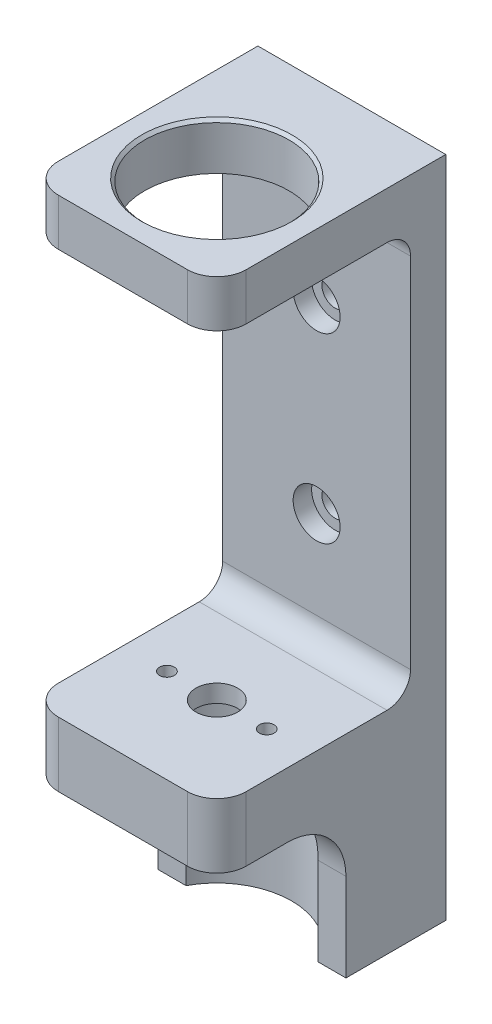
ISO-10303-21;
HEADER;
FILE_DESCRIPTION(('STEP AP214'),'2;1');
FILE_NAME('part.step','',(''),(''),'','','');
FILE_SCHEMA(('AUTOMOTIVE_DESIGN { 1 0 10303 214 1 1 1 1 }'));
ENDSEC;
DATA;
#1=APPLICATION_CONTEXT('core data for automotive mechanical design processes');
#2=APPLICATION_PROTOCOL_DEFINITION('international standard','automotive_design',2000,#1);
#3=PRODUCT_CONTEXT('',#1,'mechanical');
#4=PRODUCT('Part','Part','',(#3));
#5=PRODUCT_RELATED_PRODUCT_CATEGORY('part','',(#4));
#6=PRODUCT_DEFINITION_FORMATION('','',#4);
#7=PRODUCT_DEFINITION_CONTEXT('part definition',#1,'design');
#8=PRODUCT_DEFINITION('design','',#6,#7);
#9=PRODUCT_DEFINITION_SHAPE('','',#8);
#10=(LENGTH_UNIT() NAMED_UNIT(*) SI_UNIT(.MILLI.,.METRE.));
#11=(NAMED_UNIT(*) PLANE_ANGLE_UNIT() SI_UNIT($,.RADIAN.));
#12=(NAMED_UNIT(*) SI_UNIT($,.STERADIAN.) SOLID_ANGLE_UNIT());
#13=UNCERTAINTY_MEASURE_WITH_UNIT(LENGTH_MEASURE(1.E-05),#10,'distance_accuracy_value','');
#14=(GEOMETRIC_REPRESENTATION_CONTEXT(3) GLOBAL_UNCERTAINTY_ASSIGNED_CONTEXT((#13)) GLOBAL_UNIT_ASSIGNED_CONTEXT((#10,
#11,#12)) REPRESENTATION_CONTEXT('',''));
#15=CARTESIAN_POINT('',(0.,0.,0.));
#16=DIRECTION('',(0.,0.,1.));
#17=DIRECTION('',(1.,0.,0.));
#18=AXIS2_PLACEMENT_3D('',#15,#16,#17);
#19=CARTESIAN_POINT('',(14.,70.0000000000001,28.));
#20=DIRECTION('',(0.,1.,0.));
#21=DIRECTION('',(-1.,0.,0.));
#22=AXIS2_PLACEMENT_3D('',#19,#20,#21);
#23=PLANE('',#22);
#24=CARTESIAN_POINT('',(-1.29414805625495E-13,70.0000000000001,14.));
#25=DIRECTION('',(0.,1.,0.));
#26=DIRECTION('',(-1.,0.,0.));
#27=AXIS2_PLACEMENT_3D('',#24,#25,#26);
#28=CIRCLE('',#27,12.3);
#29=CARTESIAN_POINT('',(-12.3000000000001,70.,14.));
#30=VERTEX_POINT('',#29);
#31=EDGE_CURVE('E218',#30,#30,#28,.F.);
#32=ORIENTED_EDGE('',*,*,#31,.F.);
#33=EDGE_LOOP('',(#32));
#34=FACE_BOUND('',#33,.T.);
#35=DIRECTION('',(-1.,0.,0.));
#36=VECTOR('',#35,1.);
#37=CARTESIAN_POINT('',(14.0000000000001,70.,0.999999999999986));
#38=LINE('',#37,#36);
#39=CARTESIAN_POINT('',(16.,70.0000000000001,0.999999999999986));
#40=VERTEX_POINT('',#39);
#41=CARTESIAN_POINT('',(-16.,70.,0.999999999999986));
#42=VERTEX_POINT('',#41);
#43=EDGE_CURVE('E67',#40,#42,#38,.T.);
#44=ORIENTED_EDGE('',*,*,#43,.F.);
#45=DIRECTION('',(0.,0.,1.));
#46=VECTOR('',#45,1.);
#47=CARTESIAN_POINT('',(16.,70.0000000000001,0.));
#48=LINE('',#47,#46);
#49=CARTESIAN_POINT('',(16.,70.0000000000001,25.));
#50=VERTEX_POINT('',#49);
#51=EDGE_CURVE('E282',#40,#50,#48,.T.);
#52=ORIENTED_EDGE('',*,*,#51,.T.);
#53=CARTESIAN_POINT('',(11.,70.0000000000001,25.));
#54=DIRECTION('',(0.,1.,0.));
#55=DIRECTION('',(-1.,0.,0.));
#56=AXIS2_PLACEMENT_3D('',#53,#54,#55);
#57=CIRCLE('',#56,5.);
#58=CARTESIAN_POINT('',(11.,70.0000000000001,30.));
#59=VERTEX_POINT('',#58);
#60=EDGE_CURVE('E291',#50,#59,#57,.F.);
#61=ORIENTED_EDGE('',*,*,#60,.T.);
#62=DIRECTION('',(-1.,0.,0.));
#63=VECTOR('',#62,1.);
#64=CARTESIAN_POINT('',(0.,70.0000000000001,30.));
#65=LINE('',#64,#63);
#66=CARTESIAN_POINT('',(-11.,70.,30.));
#67=VERTEX_POINT('',#66);
#68=EDGE_CURVE('E289',#59,#67,#65,.T.);
#69=ORIENTED_EDGE('',*,*,#68,.T.);
#70=CARTESIAN_POINT('',(-11.,70.,25.));
#71=DIRECTION('',(0.,1.,0.));
#72=DIRECTION('',(-1.,0.,0.));
#73=AXIS2_PLACEMENT_3D('',#70,#71,#72);
#74=CIRCLE('',#73,5.);
#75=CARTESIAN_POINT('',(-16.,70.,25.0000000000001));
#76=VERTEX_POINT('',#75);
#77=EDGE_CURVE('E287',#67,#76,#74,.F.);
#78=ORIENTED_EDGE('',*,*,#77,.T.);
#79=DIRECTION('',(0.,0.,-1.));
#80=VECTOR('',#79,1.);
#81=CARTESIAN_POINT('',(-16.,70.,0.));
#82=LINE('',#81,#80);
#83=EDGE_CURVE('E284',#76,#42,#82,.T.);
#84=ORIENTED_EDGE('',*,*,#83,.T.);
#85=EDGE_LOOP('',(#44,#52,#61,#69,#78,#84));
#86=FACE_BOUND('',#85,.T.);
#87=ADVANCED_FACE('F51',(#34,#86),#23,.F.);
#88=CARTESIAN_POINT('',(0.,20.,-9.00000000000001));
#89=DIRECTION('',(0.,0.,1.));
#90=DIRECTION('',(1.,0.,0.));
#91=AXIS2_PLACEMENT_3D('',#88,#89,#90);
#92=CYLINDRICAL_SURFACE('',#91,2.25);
#93=CARTESIAN_POINT('',(0.,20.,-9.00000000000001));
#94=DIRECTION('',(0.,0.,1.));
#95=DIRECTION('',(1.,0.,0.));
#96=AXIS2_PLACEMENT_3D('',#93,#94,#95);
#97=CIRCLE('',#96,2.25);
#98=CARTESIAN_POINT('',(2.25,20.,-9.00000000000001));
#99=VERTEX_POINT('',#98);
#100=EDGE_CURVE('E339',#99,#99,#97,.T.);
#101=ORIENTED_EDGE('',*,*,#100,.F.);
#102=EDGE_LOOP('',(#101));
#103=FACE_BOUND('',#102,.T.);
#104=CARTESIAN_POINT('',(0.,20.,-6.15));
#105=DIRECTION('',(0.,0.,1.));
#106=DIRECTION('',(1.,0.,0.));
#107=AXIS2_PLACEMENT_3D('',#104,#105,#106);
#108=CIRCLE('',#107,2.25);
#109=CARTESIAN_POINT('',(2.25,20.,-6.15));
#110=VERTEX_POINT('',#109);
#111=EDGE_CURVE('E343',#110,#110,#108,.F.);
#112=ORIENTED_EDGE('',*,*,#111,.F.);
#113=EDGE_LOOP('',(#112));
#114=FACE_BOUND('',#113,.T.);
#115=ADVANCED_FACE('F421',(#103,#114),#92,.F.);
#116=CARTESIAN_POINT('',(0.,51.,-9.00000000000001));
#117=DIRECTION('',(0.,0.,1.));
#118=DIRECTION('',(1.,0.,0.));
#119=AXIS2_PLACEMENT_3D('',#116,#117,#118);
#120=CYLINDRICAL_SURFACE('',#119,2.25);
#121=CARTESIAN_POINT('',(0.,51.,-9.00000000000001));
#122=DIRECTION('',(0.,0.,1.));
#123=DIRECTION('',(1.,0.,0.));
#124=AXIS2_PLACEMENT_3D('',#121,#122,#123);
#125=CIRCLE('',#124,2.25);
#126=CARTESIAN_POINT('',(2.25,51.,-9.00000000000001));
#127=VERTEX_POINT('',#126);
#128=EDGE_CURVE('E350',#127,#127,#125,.T.);
#129=ORIENTED_EDGE('',*,*,#128,.F.);
#130=EDGE_LOOP('',(#129));
#131=FACE_BOUND('',#130,.T.);
#132=CARTESIAN_POINT('',(0.,51.,-6.15));
#133=DIRECTION('',(0.,0.,1.));
#134=DIRECTION('',(1.,0.,0.));
#135=AXIS2_PLACEMENT_3D('',#132,#133,#134);
#136=CIRCLE('',#135,2.25);
#137=CARTESIAN_POINT('',(2.25,51.,-6.15));
#138=VERTEX_POINT('',#137);
#139=EDGE_CURVE('E332',#138,#138,#136,.F.);
#140=ORIENTED_EDGE('',*,*,#139,.F.);
#141=EDGE_LOOP('',(#140));
#142=FACE_BOUND('',#141,.T.);
#143=ADVANCED_FACE('F426',(#131,#142),#120,.F.);
#144=CARTESIAN_POINT('',(13.,-9.99999999999995,14.));
#145=DIRECTION('',(0.,-1.,0.));
#146=DIRECTION('',(1.,0.,0.));
#147=AXIS2_PLACEMENT_3D('',#144,#145,#146);
#148=PLANE('',#147);
#149=CARTESIAN_POINT('',(0.,-9.99999999999998,14.));
#150=DIRECTION('',(0.,1.,0.));
#151=DIRECTION('',(-1.,0.,0.));
#152=AXIS2_PLACEMENT_3D('',#149,#150,#151);
#153=CIRCLE('',#152,12.75);
#154=CARTESIAN_POINT('',(-12.1063000128032,-10.,18.));
#155=VERTEX_POINT('',#154);
#156=CARTESIAN_POINT('',(12.1063000128033,-9.99999999999996,18.));
#157=VERTEX_POINT('',#156);
#158=EDGE_CURVE('E378',#155,#157,#153,.T.);
#159=ORIENTED_EDGE('',*,*,#158,.T.);
#160=DIRECTION('',(1.,0.,0.));
#161=VECTOR('',#160,1.);
#162=CARTESIAN_POINT('',(14.,-9.99999999999994,18.));
#163=LINE('',#162,#161);
#164=CARTESIAN_POINT('',(16.,-10.,18.));
#165=VERTEX_POINT('',#164);
#166=EDGE_CURVE('E383',#157,#165,#163,.T.);
#167=ORIENTED_EDGE('',*,*,#166,.T.);
#168=DIRECTION('',(0.,0.,-1.));
#169=VECTOR('',#168,1.);
#170=CARTESIAN_POINT('',(16.,-10.,25.));
#171=LINE('',#170,#169);
#172=CARTESIAN_POINT('',(16.,-10.,25.));
#173=VERTEX_POINT('',#172);
#174=EDGE_CURVE('E259',#173,#165,#171,.T.);
#175=ORIENTED_EDGE('',*,*,#174,.F.);
#176=CARTESIAN_POINT('',(11.0000000000001,-9.99999999999995,25.));
#177=DIRECTION('',(0.,-1.,0.));
#178=DIRECTION('',(1.,0.,0.));
#179=AXIS2_PLACEMENT_3D('',#176,#177,#178);
#180=CIRCLE('',#179,5.);
#181=CARTESIAN_POINT('',(11.0000000000001,-9.99999999999995,30.));
#182=VERTEX_POINT('',#181);
#183=EDGE_CURVE('E239',#173,#182,#180,.T.);
#184=ORIENTED_EDGE('',*,*,#183,.T.);
#185=DIRECTION('',(-1.,0.,0.));
#186=VECTOR('',#185,1.);
#187=CARTESIAN_POINT('',(0.,-9.99999999999997,30.));
#188=LINE('',#187,#186);
#189=CARTESIAN_POINT('',(-10.9999999999999,-9.99999999999999,30.));
#190=VERTEX_POINT('',#189);
#191=EDGE_CURVE('E221',#182,#190,#188,.T.);
#192=ORIENTED_EDGE('',*,*,#191,.T.);
#193=CARTESIAN_POINT('',(-10.9999999999999,-9.99999999999999,25.));
#194=DIRECTION('',(0.,-1.,0.));
#195=DIRECTION('',(1.,0.,0.));
#196=AXIS2_PLACEMENT_3D('',#193,#194,#195);
#197=CIRCLE('',#196,5.);
#198=CARTESIAN_POINT('',(-16.,-10.,25.));
#199=VERTEX_POINT('',#198);
#200=EDGE_CURVE('E236',#190,#199,#197,.T.);
#201=ORIENTED_EDGE('',*,*,#200,.T.);
#202=DIRECTION('',(0.,0.,1.));
#203=VECTOR('',#202,1.);
#204=CARTESIAN_POINT('',(-16.,-9.99999999999999,18.));
#205=LINE('',#204,#203);
#206=CARTESIAN_POINT('',(-16.,-9.99999999999999,18.));
#207=VERTEX_POINT('',#206);
#208=EDGE_CURVE('E268',#207,#199,#205,.T.);
#209=ORIENTED_EDGE('',*,*,#208,.F.);
#210=DIRECTION('',(1.,0.,0.));
#211=VECTOR('',#210,1.);
#212=CARTESIAN_POINT('',(-11.25,-9.99999999999999,18.));
#213=LINE('',#212,#211);
#214=EDGE_CURVE('E380',#207,#155,#213,.T.);
#215=ORIENTED_EDGE('',*,*,#214,.T.);
#216=EDGE_LOOP('',(#159,#167,#175,#184,#192,#201,#209,#215));
#217=FACE_BOUND('',#216,.T.);
#218=ADVANCED_FACE('F458',(#217),#148,.T.);
#219=CARTESIAN_POINT('',(14.0000000000001,1.00000000000003,1.));
#220=DIRECTION('',(0.,-1.,0.));
#221=DIRECTION('',(1.,0.,0.));
#222=AXIS2_PLACEMENT_3D('',#219,#220,#221);
#223=PLANE('',#222);
#224=CARTESIAN_POINT('',(0.,1.,14.));
#225=DIRECTION('',(0.,-1.,0.));
#226=DIRECTION('',(1.,0.,0.));
#227=AXIS2_PLACEMENT_3D('',#224,#225,#226);
#228=CIRCLE('',#227,3.55);
#229=CARTESIAN_POINT('',(3.55,1.00000000000001,14.));
#230=VERTEX_POINT('',#229);
#231=EDGE_CURVE('E369',#230,#230,#228,.T.);
#232=ORIENTED_EDGE('',*,*,#231,.T.);
#233=EDGE_LOOP('',(#232));
#234=FACE_BOUND('',#233,.T.);
#235=CARTESIAN_POINT('',(8.50000000000001,1.00000000000002,14.));
#236=DIRECTION('',(0.,1.,0.));
#237=DIRECTION('',(0.,0.,1.));
#238=AXIS2_PLACEMENT_3D('',#235,#236,#237);
#239=CIRCLE('',#238,1.24999999999997);
#240=CARTESIAN_POINT('',(8.50000000000001,1.00000000000002,15.25));
#241=VERTEX_POINT('',#240);
#242=EDGE_CURVE('E372',#241,#241,#239,.T.);
#243=ORIENTED_EDGE('',*,*,#242,.F.);
#244=EDGE_LOOP('',(#243));
#245=FACE_BOUND('',#244,.T.);
#246=CARTESIAN_POINT('',(-8.49999999999999,0.999999999999989,14.));
#247=DIRECTION('',(0.,1.,0.));
#248=DIRECTION('',(0.,0.,1.));
#249=AXIS2_PLACEMENT_3D('',#246,#247,#248);
#250=CIRCLE('',#249,1.24999999999997);
#251=CARTESIAN_POINT('',(-8.49999999999999,0.999999999999989,15.25));
#252=VERTEX_POINT('',#251);
#253=EDGE_CURVE('E375',#252,#252,#250,.T.);
#254=ORIENTED_EDGE('',*,*,#253,.F.);
#255=EDGE_LOOP('',(#254));
#256=FACE_BOUND('',#255,.T.);
#257=DIRECTION('',(-1.,0.,0.));
#258=VECTOR('',#257,1.);
#259=CARTESIAN_POINT('',(14.0000000000001,0.999999999999978,0.999999999999994));
#260=LINE('',#259,#258);
#261=CARTESIAN_POINT('',(16.,0.999999999999978,0.999999999999994));
#262=VERTEX_POINT('',#261);
#263=CARTESIAN_POINT('',(-16.,0.999999999999978,0.999999999999994));
#264=VERTEX_POINT('',#263);
#265=EDGE_CURVE('E360',#262,#264,#260,.T.);
#266=ORIENTED_EDGE('',*,*,#265,.T.);
#267=DIRECTION('',(0.,0.,-1.));
#268=VECTOR('',#267,1.);
#269=CARTESIAN_POINT('',(-16.,0.999999999999978,25.));
#270=LINE('',#269,#268);
#271=CARTESIAN_POINT('',(-16.,0.999999999999978,25.));
#272=VERTEX_POINT('',#271);
#273=EDGE_CURVE('E272',#272,#264,#270,.T.);
#274=ORIENTED_EDGE('',*,*,#273,.F.);
#275=CARTESIAN_POINT('',(-10.9999999999999,0.999999999999987,25.));
#276=DIRECTION('',(0.,-1.,0.));
#277=DIRECTION('',(1.,0.,0.));
#278=AXIS2_PLACEMENT_3D('',#275,#276,#277);
#279=CIRCLE('',#278,5.);
#280=CARTESIAN_POINT('',(-10.9999999999999,0.999999999999987,30.));
#281=VERTEX_POINT('',#280);
#282=EDGE_CURVE('E233',#272,#281,#279,.F.);
#283=ORIENTED_EDGE('',*,*,#282,.T.);
#284=DIRECTION('',(1.,0.,0.));
#285=VECTOR('',#284,1.);
#286=CARTESIAN_POINT('',(0.,1.,30.));
#287=LINE('',#286,#285);
#288=CARTESIAN_POINT('',(11.0000000000001,1.00000000000002,30.));
#289=VERTEX_POINT('',#288);
#290=EDGE_CURVE('E230',#281,#289,#287,.T.);
#291=ORIENTED_EDGE('',*,*,#290,.T.);
#292=CARTESIAN_POINT('',(11.0000000000001,1.00000000000002,25.));
#293=DIRECTION('',(0.,-1.,0.));
#294=DIRECTION('',(1.,0.,0.));
#295=AXIS2_PLACEMENT_3D('',#292,#293,#294);
#296=CIRCLE('',#295,5.);
#297=CARTESIAN_POINT('',(16.,1.00000000000003,25.));
#298=VERTEX_POINT('',#297);
#299=EDGE_CURVE('E227',#289,#298,#296,.F.);
#300=ORIENTED_EDGE('',*,*,#299,.T.);
#301=DIRECTION('',(0.,0.,1.));
#302=VECTOR('',#301,1.);
#303=CARTESIAN_POINT('',(16.,0.999999999999978,0.999999999999994));
#304=LINE('',#303,#302);
#305=EDGE_CURVE('E255',#262,#298,#304,.T.);
#306=ORIENTED_EDGE('',*,*,#305,.F.);
#307=EDGE_LOOP('',(#266,#274,#283,#291,#300,#306));
#308=FACE_BOUND('',#307,.T.);
#309=ADVANCED_FACE('F448',(#234,#245,#256,#308),#223,.F.);
#310=CARTESIAN_POINT('',(0.,-10.,14.));
#311=DIRECTION('',(0.,1.,0.));
#312=DIRECTION('',(-1.,0.,0.));
#313=AXIS2_PLACEMENT_3D('',#310,#311,#312);
#314=CYLINDRICAL_SURFACE('',#313,12.75);
#315=CARTESIAN_POINT('',(0.,-2.,14.));
#316=DIRECTION('',(0.,-1.,0.));
#317=DIRECTION('',(1.,0.,0.));
#318=AXIS2_PLACEMENT_3D('',#315,#316,#317);
#319=CIRCLE('',#318,12.75);
#320=CARTESIAN_POINT('',(12.75,-1.99999999999998,14.));
#321=VERTEX_POINT('',#320);
#322=EDGE_CURVE('E328',#321,#321,#319,.T.);
#323=ORIENTED_EDGE('',*,*,#322,.F.);
#324=EDGE_LOOP('',(#323));
#325=FACE_BOUND('',#324,.T.);
#326=ORIENTED_EDGE('',*,*,#158,.F.);
#327=CARTESIAN_POINT('',(-12.1063000128032,-9.99999999999999,18.));
#328=CARTESIAN_POINT('',(-12.1426028784487,-9.9999992980865,17.8901303788641));
#329=CARTESIAN_POINT('',(-12.1774036448893,-10.0018111961032,17.7797770822206));
#330=CARTESIAN_POINT('',(-12.2439602622639,-10.0091462345457,17.558273402362));
#331=CARTESIAN_POINT('',(-12.2757159740108,-10.0146695445249,17.4471229829605));
#332=CARTESIAN_POINT('',(-12.3663393041272,-10.0369328782381,17.1127848526709));
#333=CARTESIAN_POINT('',(-12.4205756064043,-10.059366246719,16.8886724389523));
#334=CARTESIAN_POINT('',(-12.5162946934557,-10.1197383613079,16.4407271711716));
#335=CARTESIAN_POINT('',(-12.557824252466,-10.1576190132938,16.2168963876955));
#336=CARTESIAN_POINT('',(-12.6284957216809,-10.2490410930225,15.7704945091759));
#337=CARTESIAN_POINT('',(-12.6576387596365,-10.3025810942845,15.5479233012738));
#338=CARTESIAN_POINT('',(-12.7039222223397,-10.4252818940157,15.1056072961244));
#339=CARTESIAN_POINT('',(-12.7210496822493,-10.4944594594037,14.8858658022443));
#340=CARTESIAN_POINT('',(-12.7438744135214,-10.648054260172,14.4511610487475));
#341=CARTESIAN_POINT('',(-12.7495708611934,-10.7324725932867,14.2361981345669));
#342=CARTESIAN_POINT('',(-12.7503824689439,-10.9160094652795,13.812588797693));
#343=CARTESIAN_POINT('',(-12.7454956298827,-11.0151307781962,13.6039435759349));
#344=CARTESIAN_POINT('',(-12.7261740568331,-11.2273632112715,13.1943728669076));
#345=CARTESIAN_POINT('',(-12.7117392554669,-11.3404744301492,12.993447434126));
#346=CARTESIAN_POINT('',(-12.674199669253,-11.5817876843597,12.5973796193875));
#347=CARTESIAN_POINT('',(-12.6509628749009,-11.710197990231,12.4023767472644));
#348=CARTESIAN_POINT('',(-12.5971697502347,-11.9798181332684,12.0224590647849));
#349=CARTESIAN_POINT('',(-12.5666110538617,-12.1210320987248,11.8375475391919));
#350=CARTESIAN_POINT('',(-12.4660006253368,-12.562647189506,11.2991700784598));
#351=CARTESIAN_POINT('',(-12.3870036325935,-12.88108375929,10.961959585049));
#352=CARTESIAN_POINT('',(-12.2045510724158,-13.6073725886279,10.2921116032269));
#353=CARTESIAN_POINT('',(-12.0992183439602,-14.021501729287,9.96677992318281));
#354=CARTESIAN_POINT('',(-11.9419122725758,-14.6769192795156,9.53041074531059));
#355=CARTESIAN_POINT('',(-11.88954830323,-14.9013006328918,9.39346489857232));
#356=CARTESIAN_POINT('',(-11.7871414414082,-15.360649863887,9.13740828128432));
#357=CARTESIAN_POINT('',(-11.7370989219077,-15.5956194307872,9.01830036986139));
#358=CARTESIAN_POINT('',(-11.6371429780679,-16.0965862973805,8.78881310683678));
#359=CARTESIAN_POINT('',(-11.5876471759054,-16.363472025748,8.68018627604174));
#360=CARTESIAN_POINT('',(-11.4965481886978,-16.9067260322259,8.48607363173822));
#361=CARTESIAN_POINT('',(-11.4549414127382,-17.1830899281052,8.40057728213264));
#362=CARTESIAN_POINT('',(-11.3820135045227,-17.7428278418327,8.25378522690692));
#363=CARTESIAN_POINT('',(-11.3506691166864,-18.0261844230752,8.19243473967486));
#364=CARTESIAN_POINT('',(-11.3000371672751,-18.5980609256368,8.0945167725653));
#365=CARTESIAN_POINT('',(-11.2807402671863,-18.8865766689709,8.05793009536283));
#366=CARTESIAN_POINT('',(-11.2620612156883,-19.3132891576786,8.02265842132257));
#367=CARTESIAN_POINT('',(-11.2575434419773,-19.4505242579193,8.01416064128136));
#368=CARTESIAN_POINT('',(-11.251512000002,-19.7251655261986,8.00283376163496));
#369=CARTESIAN_POINT('',(-11.2499955321405,-19.8625714150694,7.99999937922814));
#370=CARTESIAN_POINT('',(-11.2499999999999,-20.,8.));
#371=B_SPLINE_CURVE_WITH_KNOTS('',3,(#327,#328,#329,#330,#331,#332,#333,#334,#335,#336,#337,
#338,#339,#340,#341,#342,#343,#344,#345,#346,#347,#348,#349,#350,#351,#352,#353,#354,#355,#356,
#357,#358,#359,#360,#361,#362,#363,#364,#365,#366,#367,#368,#369,#370),.UNSPECIFIED.,.F.,.F.,(4,
2,2,2,2,2,2,2,2,2,2,2,2,2,2,2,2,2,2,2,2,4),(0.,0.347085093065775,0.694186043559889,
1.38826881512972,2.0797650073287,2.7711982276339,3.46337636333589,4.15560437388906,
4.84796315489772,5.54032682178119,6.24351415794804,6.94692903496781,8.35340328180301,
9.95758175012059,10.7610349859688,11.5646168646064,12.440579066798,13.3161415876591,
14.189706039302,15.0625925109825,15.4751809473784,15.8873843424173),.UNSPECIFIED.);
#372=CARTESIAN_POINT('',(-11.2499999999999,-20.,8.00000000000001));
#373=VERTEX_POINT('',#372);
#374=EDGE_CURVE('E392',#155,#373,#371,.T.);
#375=ORIENTED_EDGE('',*,*,#374,.T.);
#376=DIRECTION('',(0.,1.,0.));
#377=VECTOR('',#376,1.);
#378=CARTESIAN_POINT('',(-11.2499999999999,-35.,8.00000000000001));
#379=LINE('',#378,#377);
#380=CARTESIAN_POINT('',(-11.2499999999999,-35.,8.00000000000001));
#381=VERTEX_POINT('',#380);
#382=EDGE_CURVE('E223',#381,#373,#379,.T.);
#383=ORIENTED_EDGE('',*,*,#382,.F.);
#384=CARTESIAN_POINT('',(0.,-35.,14.));
#385=DIRECTION('',(0.,1.,0.));
#386=DIRECTION('',(1.,0.,0.));
#387=AXIS2_PLACEMENT_3D('',#384,#385,#386);
#388=CIRCLE('',#387,12.75);
#389=CARTESIAN_POINT('',(11.2500000000001,-35.,8.));
#390=VERTEX_POINT('',#389);
#391=EDGE_CURVE('E200',#390,#381,#388,.T.);
#392=ORIENTED_EDGE('',*,*,#391,.F.);
#393=DIRECTION('',(0.,1.,0.));
#394=VECTOR('',#393,1.);
#395=CARTESIAN_POINT('',(11.2500000000001,-35.,8.));
#396=LINE('',#395,#394);
#397=CARTESIAN_POINT('',(11.25,-20.,8.));
#398=VERTEX_POINT('',#397);
#399=EDGE_CURVE('E197',#390,#398,#396,.T.);
#400=ORIENTED_EDGE('',*,*,#399,.T.);
#401=CARTESIAN_POINT('',(11.25,-20.,8.));
#402=CARTESIAN_POINT('',(11.2499955452556,-19.8661070355832,7.99999908622221));
#403=CARTESIAN_POINT('',(11.2514349645528,-19.732233144332,8.00268966645491));
#404=CARTESIAN_POINT('',(11.2571585045735,-19.4647683278436,8.01343700117412));
#405=CARTESIAN_POINT('',(11.2614424841985,-19.3311773889008,8.02149348949632));
#406=CARTESIAN_POINT('',(11.2784864290012,-18.9314222543217,8.0536672012479));
#407=CARTESIAN_POINT('',(11.2954385552134,-18.6660278459734,8.08578874042292));
#408=CARTESIAN_POINT('',(11.3394987487632,-18.1410878759688,8.17071886528152));
#409=CARTESIAN_POINT('',(11.3665469400591,-17.8815172118868,8.22340556916196));
#410=CARTESIAN_POINT('',(11.4294461552139,-17.3683416189737,8.34887817613295));
#411=CARTESIAN_POINT('',(11.4652984009222,-17.1147375235562,8.42166686920462));
#412=CARTESIAN_POINT('',(11.5440080209129,-16.6156678469532,8.58643529234788));
#413=CARTESIAN_POINT('',(11.5868485757633,-16.3701843865895,8.67836908752676));
#414=CARTESIAN_POINT('',(11.6776947318613,-15.8880055157967,8.88079642993244));
#415=CARTESIAN_POINT('',(11.7257002403669,-15.6513099476749,8.99128964392615));
#416=CARTESIAN_POINT('',(11.8249651203225,-15.1873466644397,9.23035870010999));
#417=CARTESIAN_POINT('',(11.8762306943932,-14.9600983691918,9.3589696142869));
#418=CARTESIAN_POINT('',(11.9798615385535,-14.516521392564,9.63343007403222));
#419=CARTESIAN_POINT('',(12.0322268571678,-14.3001931944595,9.77928038158728));
#420=CARTESIAN_POINT('',(12.1400049894355,-13.8630691322365,10.0995518161199));
#421=CARTESIAN_POINT('',(12.1953383139086,-13.6432329391936,10.2753125115691));
#422=CARTESIAN_POINT('',(12.302247427379,-13.2186215241779,10.6452600504078));
#423=CARTESIAN_POINT('',(12.3538228912775,-13.0138476052527,10.8394484846734));
#424=CARTESIAN_POINT('',(12.4505804868738,-12.6208279501097,11.2451839803764));
#425=CARTESIAN_POINT('',(12.4957659586613,-12.4325735986835,11.4567218810903));
#426=CARTESIAN_POINT('',(12.5771776580255,-12.0740236921213,11.8959672375901));
#427=CARTESIAN_POINT('',(12.613408571233,-11.9037187715025,12.123666156204));
#428=CARTESIAN_POINT('',(12.6738034176764,-11.5858343160858,12.5889436151119));
#429=CARTESIAN_POINT('',(12.6982025105081,-11.4378560089888,12.8262184382825));
#430=CARTESIAN_POINT('',(12.7338244095671,-11.1619243513745,13.3131347020343));
#431=CARTESIAN_POINT('',(12.7450468742015,-11.0339715200748,13.5627764630428));
#432=CARTESIAN_POINT('',(12.7523359741958,-10.7995425955185,14.0718908660677));
#433=CARTESIAN_POINT('',(12.7484175602125,-10.693045425462,14.3313535599107));
#434=CARTESIAN_POINT('',(12.7238503697898,-10.5024499499992,14.857581482811));
#435=CARTESIAN_POINT('',(12.7032061303303,-10.4183455786313,15.1243447125966));
#436=CARTESIAN_POINT('',(12.6499250015054,-10.2874564507592,15.6090706698647));
#437=CARTESIAN_POINT('',(12.6204527884534,-10.2365835411129,15.826291646416));
#438=CARTESIAN_POINT('',(12.5497214161393,-10.1497269218769,16.2617800888365));
#439=CARTESIAN_POINT('',(12.5084635006517,-10.1137416421393,16.4800474418903));
#440=CARTESIAN_POINT('',(12.4139172263733,-10.0564045136811,16.9167051961691));
#441=CARTESIAN_POINT('',(12.3605868230777,-10.0351048849825,17.1350933009233));
#442=CARTESIAN_POINT('',(12.2421907068158,-10.0068826177839,17.5696317396395));
#443=CARTESIAN_POINT('',(12.1771239098495,-9.99996130803793,17.7857818649451));
#444=CARTESIAN_POINT('',(12.1063000128033,-9.99999999999995,18.));
#445=B_SPLINE_CURVE_WITH_KNOTS('',3,(#401,#402,#403,#404,#405,#406,#407,#408,#409,#410,#411,
#412,#413,#414,#415,#416,#417,#418,#419,#420,#421,#422,#423,#424,#425,#426,#427,#428,#429,#430,
#431,#432,#433,#434,#435,#436,#437,#438,#439,#440,#441,#442,#443,#444),.UNSPECIFIED.,.F.,.F.,(4,
2,2,2,2,2,2,2,2,2,2,2,2,2,2,2,2,2,2,2,2,4),(0.,0.401606529066352,0.803193138787938,
1.60562544051287,2.40337253092492,3.2012303973807,3.99719557280456,4.79314645825602,
5.59065986559462,6.3882085364689,7.24774787514497,8.10736148591565,8.96652409708508,
9.825236179871,10.6660999515687,11.5069855214536,12.3470409824778,13.1868686497039,
13.8612109613758,14.5354821343094,15.2121387201155,15.8888578354945),.UNSPECIFIED.);
#446=EDGE_CURVE('E75',#398,#157,#445,.T.);
#447=ORIENTED_EDGE('',*,*,#446,.T.);
#448=EDGE_LOOP('',(#326,#375,#383,#392,#400,#447));
#449=FACE_BOUND('',#448,.T.);
#450=ADVANCED_FACE('F397',(#325,#449),#314,.F.);
#451=CARTESIAN_POINT('',(-8.49999999999999,0.999999999999988,14.));
#452=DIRECTION('',(0.,1.,0.));
#453=DIRECTION('',(0.,0.,1.));
#454=AXIS2_PLACEMENT_3D('',#451,#452,#453);
#455=CYLINDRICAL_SURFACE('',#454,1.24999999999997);
#456=ORIENTED_EDGE('',*,*,#253,.T.);
#457=EDGE_LOOP('',(#456));
#458=FACE_BOUND('',#457,.T.);
#459=CARTESIAN_POINT('',(-8.49999999999998,-2.00000000000001,14.));
#460=DIRECTION('',(0.,-1.,0.));
#461=DIRECTION('',(1.,0.,0.));
#462=AXIS2_PLACEMENT_3D('',#459,#460,#461);
#463=CIRCLE('',#462,1.24999999999997);
#464=CARTESIAN_POINT('',(-7.25000000000001,-2.00000000000001,14.));
#465=VERTEX_POINT('',#464);
#466=EDGE_CURVE('E319',#465,#465,#463,.T.);
#467=ORIENTED_EDGE('',*,*,#466,.T.);
#468=EDGE_LOOP('',(#467));
#469=FACE_BOUND('',#468,.T.);
#470=ADVANCED_FACE('F550',(#458,#469),#455,.F.);
#471=CARTESIAN_POINT('',(8.50000000000001,1.00000000000002,14.));
#472=DIRECTION('',(0.,1.,0.));
#473=DIRECTION('',(0.,0.,1.));
#474=AXIS2_PLACEMENT_3D('',#471,#472,#473);
#475=CYLINDRICAL_SURFACE('',#474,1.24999999999997);
#476=ORIENTED_EDGE('',*,*,#242,.T.);
#477=EDGE_LOOP('',(#476));
#478=FACE_BOUND('',#477,.T.);
#479=CARTESIAN_POINT('',(8.50000000000001,-1.99999999999999,14.));
#480=DIRECTION('',(0.,-1.,0.));
#481=DIRECTION('',(1.,0.,0.));
#482=AXIS2_PLACEMENT_3D('',#479,#480,#481);
#483=CIRCLE('',#482,1.24999999999997);
#484=CARTESIAN_POINT('',(9.74999999999999,-1.99999999999998,14.));
#485=VERTEX_POINT('',#484);
#486=EDGE_CURVE('E325',#485,#485,#483,.T.);
#487=ORIENTED_EDGE('',*,*,#486,.T.);
#488=EDGE_LOOP('',(#487));
#489=FACE_BOUND('',#488,.T.);
#490=ADVANCED_FACE('F547',(#478,#489),#475,.F.);
#491=CARTESIAN_POINT('',(0.,0.,-9.));
#492=DIRECTION('',(0.,0.,-1.));
#493=DIRECTION('',(-1.,0.,0.));
#494=AXIS2_PLACEMENT_3D('',#491,#492,#493);
#495=PLANE('',#494);
#496=ORIENTED_EDGE('',*,*,#128,.T.);
#497=EDGE_LOOP('',(#496));
#498=FACE_BOUND('',#497,.T.);
#499=ORIENTED_EDGE('',*,*,#100,.T.);
#500=EDGE_LOOP('',(#499));
#501=FACE_BOUND('',#500,.T.);
#502=DIRECTION('',(0.,1.,0.));
#503=VECTOR('',#502,1.);
#504=CARTESIAN_POINT('',(16.,19.5520069774823,-8.99999999999993));
#505=LINE('',#504,#503);
#506=CARTESIAN_POINT('',(16.,-34.9999999999999,-9.));
#507=VERTEX_POINT('',#506);
#508=CARTESIAN_POINT('',(16.,78.,-9.00000000000001));
#509=VERTEX_POINT('',#508);
#510=EDGE_CURVE('E313',#507,#509,#505,.T.);
#511=ORIENTED_EDGE('',*,*,#510,.F.);
#512=DIRECTION('',(1.,0.,0.));
#513=VECTOR('',#512,1.);
#514=CARTESIAN_POINT('',(-16.,-35.,-9.));
#515=LINE('',#514,#513);
#516=CARTESIAN_POINT('',(-16.,-35.,-9.));
#517=VERTEX_POINT('',#516);
#518=EDGE_CURVE('E208',#517,#507,#515,.T.);
#519=ORIENTED_EDGE('',*,*,#518,.F.);
#520=DIRECTION('',(0.,1.,0.));
#521=VECTOR('',#520,1.);
#522=CARTESIAN_POINT('',(-16.,19.5520069774823,-8.99999999999993));
#523=LINE('',#522,#521);
#524=CARTESIAN_POINT('',(-16.,78.,-9.00000000000001));
#525=VERTEX_POINT('',#524);
#526=EDGE_CURVE('E310',#517,#525,#523,.T.);
#527=ORIENTED_EDGE('',*,*,#526,.T.);
#528=DIRECTION('',(-1.,0.,0.));
#529=VECTOR('',#528,1.);
#530=CARTESIAN_POINT('',(14.,78.,-9.00000000000001));
#531=LINE('',#530,#529);
#532=EDGE_CURVE('E362',#509,#525,#531,.T.);
#533=ORIENTED_EDGE('',*,*,#532,.F.);
#534=EDGE_LOOP('',(#511,#519,#527,#533));
#535=FACE_BOUND('',#534,.T.);
#536=ADVANCED_FACE('F543',(#498,#501,#535),#495,.T.);
#537=CARTESIAN_POINT('',(-1.37176267654721E-13,82.040916292849,14.));
#538=DIRECTION('',(0.,-1.,0.));
#539=DIRECTION('',(1.,0.,0.));
#540=AXIS2_PLACEMENT_3D('',#537,#538,#539);
#541=CYLINDRICAL_SURFACE('',#540,3.55);
#542=ORIENTED_EDGE('',*,*,#231,.F.);
#543=EDGE_LOOP('',(#542));
#544=FACE_BOUND('',#543,.T.);
#545=CARTESIAN_POINT('',(0.,-2.,14.));
#546=DIRECTION('',(0.,-1.,0.));
#547=DIRECTION('',(1.,0.,0.));
#548=AXIS2_PLACEMENT_3D('',#545,#546,#547);
#549=CIRCLE('',#548,3.55);
#550=CARTESIAN_POINT('',(3.55,-1.99999999999999,14.));
#551=VERTEX_POINT('',#550);
#552=EDGE_CURVE('E322',#551,#551,#549,.T.);
#553=ORIENTED_EDGE('',*,*,#552,.T.);
#554=EDGE_LOOP('',(#553));
#555=FACE_BOUND('',#554,.T.);
#556=ADVANCED_FACE('F539',(#544,#555),#541,.F.);
#557=CARTESIAN_POINT('',(-11.,78.,25.));
#558=DIRECTION('',(0.,1.,0.));
#559=DIRECTION('',(0.,0.,1.));
#560=AXIS2_PLACEMENT_3D('',#557,#558,#559);
#561=PLANE('',#560);
#562=CARTESIAN_POINT('',(-1.29414805625495E-13,78.,14.));
#563=DIRECTION('',(0.,1.,0.));
#564=DIRECTION('',(0.,0.,1.));
#565=AXIS2_PLACEMENT_3D('',#562,#563,#564);
#566=CIRCLE('',#565,12.8);
#567=CARTESIAN_POINT('',(-1.29414805625495E-13,78.,26.8));
#568=VERTEX_POINT('',#567);
#569=EDGE_CURVE('E11',#568,#568,#566,.F.);
#570=ORIENTED_EDGE('',*,*,#569,.T.);
#571=EDGE_LOOP('',(#570));
#572=FACE_BOUND('',#571,.T.);
#573=ORIENTED_EDGE('',*,*,#532,.T.);
#574=DIRECTION('',(0.,0.,1.));
#575=VECTOR('',#574,1.);
#576=CARTESIAN_POINT('',(-16.,78.,-1.11581568975008E-13));
#577=LINE('',#576,#575);
#578=CARTESIAN_POINT('',(-16.,78.,25.));
#579=VERTEX_POINT('',#578);
#580=EDGE_CURVE('E300',#525,#579,#577,.T.);
#581=ORIENTED_EDGE('',*,*,#580,.T.);
#582=CARTESIAN_POINT('',(-11.,78.,25.));
#583=DIRECTION('',(0.,1.,0.));
#584=DIRECTION('',(0.,0.,1.));
#585=AXIS2_PLACEMENT_3D('',#582,#583,#584);
#586=CIRCLE('',#585,5.);
#587=CARTESIAN_POINT('',(-11.,78.,30.));
#588=VERTEX_POINT('',#587);
#589=EDGE_CURVE('E303',#579,#588,#586,.T.);
#590=ORIENTED_EDGE('',*,*,#589,.T.);
#591=DIRECTION('',(1.,0.,0.));
#592=VECTOR('',#591,1.);
#593=CARTESIAN_POINT('',(0.,78.,30.));
#594=LINE('',#593,#592);
#595=CARTESIAN_POINT('',(11.,78.,30.));
#596=VERTEX_POINT('',#595);
#597=EDGE_CURVE('E281',#588,#596,#594,.T.);
#598=ORIENTED_EDGE('',*,*,#597,.T.);
#599=CARTESIAN_POINT('',(11.,78.,25.));
#600=DIRECTION('',(0.,1.,0.));
#601=DIRECTION('',(0.,0.,1.));
#602=AXIS2_PLACEMENT_3D('',#599,#600,#601);
#603=CIRCLE('',#602,5.);
#604=CARTESIAN_POINT('',(16.,78.,25.));
#605=VERTEX_POINT('',#604);
#606=EDGE_CURVE('E294',#596,#605,#603,.T.);
#607=ORIENTED_EDGE('',*,*,#606,.T.);
#608=DIRECTION('',(0.,0.,-1.));
#609=VECTOR('',#608,1.);
#610=CARTESIAN_POINT('',(16.,78.,-1.09948888056441E-13));
#611=LINE('',#610,#609);
#612=EDGE_CURVE('E297',#605,#509,#611,.T.);
#613=ORIENTED_EDGE('',*,*,#612,.T.);
#614=EDGE_LOOP('',(#573,#581,#590,#598,#607,#613));
#615=FACE_BOUND('',#614,.T.);
#616=ADVANCED_FACE('F531',(#572,#615),#561,.T.);
#617=CARTESIAN_POINT('',(14.0000000000001,4.99999999999998,0.999999999999994));
#618=DIRECTION('',(-1.,0.,0.));
#619=DIRECTION('',(0.,0.,1.));
#620=AXIS2_PLACEMENT_3D('',#617,#618,#619);
#621=CYLINDRICAL_SURFACE('',#620,4.);
#622=DIRECTION('',(-1.,0.,0.));
#623=VECTOR('',#622,1.);
#624=CARTESIAN_POINT('',(14.0000000000001,4.99999999999998,-3.00000000000001));
#625=LINE('',#624,#623);
#626=CARTESIAN_POINT('',(16.,4.99999999999998,-3.00000000000001));
#627=VERTEX_POINT('',#626);
#628=CARTESIAN_POINT('',(-16.,4.99999999999998,-3.00000000000001));
#629=VERTEX_POINT('',#628);
#630=EDGE_CURVE('E363',#627,#629,#625,.T.);
#631=ORIENTED_EDGE('',*,*,#630,.T.);
#632=CARTESIAN_POINT('',(-16.,4.99999999999998,0.999999999999994));
#633=DIRECTION('',(1.,0.,0.));
#634=DIRECTION('',(0.,0.,1.));
#635=AXIS2_PLACEMENT_3D('',#632,#633,#634);
#636=CIRCLE('',#635,4.);
#637=EDGE_CURVE('E275',#264,#629,#636,.T.);
#638=ORIENTED_EDGE('',*,*,#637,.F.);
#639=ORIENTED_EDGE('',*,*,#265,.F.);
#640=CARTESIAN_POINT('',(16.,4.99999999999998,0.999999999999994));
#641=DIRECTION('',(-1.,0.,0.));
#642=DIRECTION('',(0.,0.,-1.));
#643=AXIS2_PLACEMENT_3D('',#640,#641,#642);
#644=CIRCLE('',#643,4.);
#645=EDGE_CURVE('E252',#627,#262,#644,.T.);
#646=ORIENTED_EDGE('',*,*,#645,.F.);
#647=EDGE_LOOP('',(#631,#638,#639,#646));
#648=FACE_BOUND('',#647,.T.);
#649=ADVANCED_FACE('F444',(#648),#621,.F.);
#650=CARTESIAN_POINT('',(14.0000000000001,0.,-3.));
#651=DIRECTION('',(0.,0.,-1.));
#652=DIRECTION('',(0.,1.,0.));
#653=AXIS2_PLACEMENT_3D('',#650,#651,#652);
#654=PLANE('',#653);
#655=CARTESIAN_POINT('',(0.,51.,-3.));
#656=DIRECTION('',(0.,0.,1.));
#657=DIRECTION('',(1.,0.,0.));
#658=AXIS2_PLACEMENT_3D('',#655,#656,#657);
#659=CIRCLE('',#658,4.);
#660=CARTESIAN_POINT('',(4.,51.,-3.));
#661=VERTEX_POINT('',#660);
#662=EDGE_CURVE('E336',#661,#661,#659,.T.);
#663=ORIENTED_EDGE('',*,*,#662,.F.);
#664=EDGE_LOOP('',(#663));
#665=FACE_BOUND('',#664,.T.);
#666=CARTESIAN_POINT('',(0.,20.,-3.));
#667=DIRECTION('',(0.,0.,1.));
#668=DIRECTION('',(1.,0.,0.));
#669=AXIS2_PLACEMENT_3D('',#666,#667,#668);
#670=CIRCLE('',#669,4.);
#671=CARTESIAN_POINT('',(4.,20.,-3.));
#672=VERTEX_POINT('',#671);
#673=EDGE_CURVE('E331',#672,#672,#670,.T.);
#674=ORIENTED_EDGE('',*,*,#673,.F.);
#675=EDGE_LOOP('',(#674));
#676=FACE_BOUND('',#675,.T.);
#677=DIRECTION('',(-1.,0.,0.));
#678=VECTOR('',#677,1.);
#679=CARTESIAN_POINT('',(14.0000000000001,66.,-3.00000000000001));
#680=LINE('',#679,#678);
#681=CARTESIAN_POINT('',(16.,66.,-3.00000000000006));
#682=VERTEX_POINT('',#681);
#683=CARTESIAN_POINT('',(-16.,66.,-3.00000000000001));
#684=VERTEX_POINT('',#683);
#685=EDGE_CURVE('E365',#682,#684,#680,.T.);
#686=ORIENTED_EDGE('',*,*,#685,.T.);
#687=DIRECTION('',(0.,1.,0.));
#688=VECTOR('',#687,1.);
#689=CARTESIAN_POINT('',(-16.,4.99999999999998,-3.00000000000001));
#690=LINE('',#689,#688);
#691=EDGE_CURVE('E278',#629,#684,#690,.T.);
#692=ORIENTED_EDGE('',*,*,#691,.F.);
#693=ORIENTED_EDGE('',*,*,#630,.F.);
#694=DIRECTION('',(0.,-1.,0.));
#695=VECTOR('',#694,1.);
#696=CARTESIAN_POINT('',(16.,66.,-3.00000000000004));
#697=LINE('',#696,#695);
#698=EDGE_CURVE('E249',#682,#627,#697,.T.);
#699=ORIENTED_EDGE('',*,*,#698,.F.);
#700=EDGE_LOOP('',(#686,#692,#693,#699));
#701=FACE_BOUND('',#700,.T.);
#702=ADVANCED_FACE('F438',(#665,#676,#701),#654,.F.);
#703=CARTESIAN_POINT('',(14.0000000000001,66.,0.999999999999986));
#704=DIRECTION('',(-1.,0.,0.));
#705=DIRECTION('',(0.,0.,1.));
#706=AXIS2_PLACEMENT_3D('',#703,#704,#705);
#707=CYLINDRICAL_SURFACE('',#706,4.);
#708=ORIENTED_EDGE('',*,*,#43,.T.);
#709=CARTESIAN_POINT('',(-16.,66.,0.999999999999986));
#710=DIRECTION('',(1.,0.,0.));
#711=DIRECTION('',(0.,0.,1.));
#712=AXIS2_PLACEMENT_3D('',#709,#710,#711);
#713=CIRCLE('',#712,4.);
#714=EDGE_CURVE('E262',#684,#42,#713,.T.);
#715=ORIENTED_EDGE('',*,*,#714,.F.);
#716=ORIENTED_EDGE('',*,*,#685,.F.);
#717=CARTESIAN_POINT('',(16.,66.,0.999999999999986));
#718=DIRECTION('',(-1.,0.,0.));
#719=DIRECTION('',(0.,0.,-1.));
#720=AXIS2_PLACEMENT_3D('',#717,#718,#719);
#721=CIRCLE('',#720,4.00000000000004);
#722=EDGE_CURVE('E246',#40,#682,#721,.T.);
#723=ORIENTED_EDGE('',*,*,#722,.F.);
#724=EDGE_LOOP('',(#708,#715,#716,#723));
#725=FACE_BOUND('',#724,.T.);
#726=ADVANCED_FACE('F406',(#725),#707,.F.);
#727=CARTESIAN_POINT('',(13.,-19.9999999999999,18.));
#728=DIRECTION('',(-1.,0.,0.));
#729=DIRECTION('',(0.,-1.,0.));
#730=AXIS2_PLACEMENT_3D('',#727,#728,#729);
#731=CYLINDRICAL_SURFACE('',#730,10.);
#732=ORIENTED_EDGE('',*,*,#446,.F.);
#733=DIRECTION('',(1.,0.,0.));
#734=VECTOR('',#733,1.);
#735=CARTESIAN_POINT('',(0.,-20.,8.));
#736=LINE('',#735,#734);
#737=CARTESIAN_POINT('',(16.,-19.9999999999999,8.00000000000004));
#738=VERTEX_POINT('',#737);
#739=EDGE_CURVE('E353',#398,#738,#736,.T.);
#740=ORIENTED_EDGE('',*,*,#739,.T.);
#741=CARTESIAN_POINT('',(16.,-19.9999999999999,18.));
#742=DIRECTION('',(-1.,0.,0.));
#743=DIRECTION('',(0.,0.,-1.));
#744=AXIS2_PLACEMENT_3D('',#741,#742,#743);
#745=CIRCLE('',#744,9.99999999999996);
#746=EDGE_CURVE('E217',#165,#738,#745,.T.);
#747=ORIENTED_EDGE('',*,*,#746,.F.);
#748=ORIENTED_EDGE('',*,*,#166,.F.);
#749=EDGE_LOOP('',(#732,#740,#747,#748));
#750=FACE_BOUND('',#749,.T.);
#751=ADVANCED_FACE('F401',(#750),#731,.F.);
#752=CARTESIAN_POINT('',(13.,-19.9999999999999,18.));
#753=DIRECTION('',(-1.,0.,0.));
#754=DIRECTION('',(0.,-1.,0.));
#755=AXIS2_PLACEMENT_3D('',#752,#753,#754);
#756=CYLINDRICAL_SURFACE('',#755,10.);
#757=ORIENTED_EDGE('',*,*,#214,.F.);
#758=CARTESIAN_POINT('',(-16.,-20.,18.));
#759=DIRECTION('',(1.,0.,0.));
#760=DIRECTION('',(0.,0.,1.));
#761=AXIS2_PLACEMENT_3D('',#758,#759,#760);
#762=CIRCLE('',#761,10.);
#763=CARTESIAN_POINT('',(-16.,-20.,8.));
#764=VERTEX_POINT('',#763);
#765=EDGE_CURVE('E265',#764,#207,#762,.T.);
#766=ORIENTED_EDGE('',*,*,#765,.F.);
#767=DIRECTION('',(1.,0.,0.));
#768=VECTOR('',#767,1.);
#769=CARTESIAN_POINT('',(0.,-20.,8.));
#770=LINE('',#769,#768);
#771=EDGE_CURVE('E357',#764,#373,#770,.T.);
#772=ORIENTED_EDGE('',*,*,#771,.T.);
#773=ORIENTED_EDGE('',*,*,#374,.F.);
#774=EDGE_LOOP('',(#757,#766,#772,#773));
#775=FACE_BOUND('',#774,.T.);
#776=ADVANCED_FACE('F405',(#775),#756,.F.);
#777=CARTESIAN_POINT('',(0.,51.,-6.15));
#778=DIRECTION('',(0.,0.,1.));
#779=DIRECTION('',(1.,0.,0.));
#780=AXIS2_PLACEMENT_3D('',#777,#778,#779);
#781=CYLINDRICAL_SURFACE('',#780,4.);
#782=CARTESIAN_POINT('',(0.,51.,-6.15));
#783=DIRECTION('',(0.,0.,1.));
#784=DIRECTION('',(1.,0.,0.));
#785=AXIS2_PLACEMENT_3D('',#782,#783,#784);
#786=CIRCLE('',#785,4.);
#787=CARTESIAN_POINT('',(4.,51.,-6.15));
#788=VERTEX_POINT('',#787);
#789=EDGE_CURVE('E335',#788,#788,#786,.T.);
#790=ORIENTED_EDGE('',*,*,#789,.F.);
#791=EDGE_LOOP('',(#790));
#792=FACE_BOUND('',#791,.T.);
#793=ORIENTED_EDGE('',*,*,#662,.T.);
#794=EDGE_LOOP('',(#793));
#795=FACE_BOUND('',#794,.T.);
#796=ADVANCED_FACE('F411',(#792,#795),#781,.F.);
#797=CARTESIAN_POINT('',(0.,0.,-6.15));
#798=DIRECTION('',(0.,0.,1.));
#799=DIRECTION('',(1.,0.,0.));
#800=AXIS2_PLACEMENT_3D('',#797,#798,#799);
#801=PLANE('',#800);
#802=ORIENTED_EDGE('',*,*,#139,.T.);
#803=EDGE_LOOP('',(#802));
#804=FACE_BOUND('',#803,.T.);
#805=ORIENTED_EDGE('',*,*,#789,.T.);
#806=EDGE_LOOP('',(#805));
#807=FACE_BOUND('',#806,.T.);
#808=ADVANCED_FACE('F417',(#804,#807),#801,.T.);
#809=CARTESIAN_POINT('',(0.,20.,-6.15));
#810=DIRECTION('',(0.,0.,1.));
#811=DIRECTION('',(1.,0.,0.));
#812=AXIS2_PLACEMENT_3D('',#809,#810,#811);
#813=CYLINDRICAL_SURFACE('',#812,4.);
#814=CARTESIAN_POINT('',(0.,20.,-6.15));
#815=DIRECTION('',(0.,0.,1.));
#816=DIRECTION('',(1.,0.,0.));
#817=AXIS2_PLACEMENT_3D('',#814,#815,#816);
#818=CIRCLE('',#817,4.);
#819=CARTESIAN_POINT('',(4.,20.,-6.15));
#820=VERTEX_POINT('',#819);
#821=EDGE_CURVE('E342',#820,#820,#818,.T.);
#822=ORIENTED_EDGE('',*,*,#821,.F.);
#823=EDGE_LOOP('',(#822));
#824=FACE_BOUND('',#823,.T.);
#825=ORIENTED_EDGE('',*,*,#673,.T.);
#826=EDGE_LOOP('',(#825));
#827=FACE_BOUND('',#826,.T.);
#828=ADVANCED_FACE('F517',(#824,#827),#813,.F.);
#829=CARTESIAN_POINT('',(0.,0.,-6.15));
#830=DIRECTION('',(0.,0.,1.));
#831=DIRECTION('',(1.,0.,0.));
#832=AXIS2_PLACEMENT_3D('',#829,#830,#831);
#833=PLANE('',#832);
#834=ORIENTED_EDGE('',*,*,#111,.T.);
#835=EDGE_LOOP('',(#834));
#836=FACE_BOUND('',#835,.T.);
#837=ORIENTED_EDGE('',*,*,#821,.T.);
#838=EDGE_LOOP('',(#837));
#839=FACE_BOUND('',#838,.T.);
#840=ADVANCED_FACE('F514',(#836,#839),#833,.T.);
#841=CARTESIAN_POINT('',(0.,-2.,14.));
#842=DIRECTION('',(0.,-1.,0.));
#843=DIRECTION('',(1.,0.,0.));
#844=AXIS2_PLACEMENT_3D('',#841,#842,#843);
#845=PLANE('',#844);
#846=ORIENTED_EDGE('',*,*,#552,.F.);
#847=EDGE_LOOP('',(#846));
#848=FACE_BOUND('',#847,.T.);
#849=ORIENTED_EDGE('',*,*,#322,.T.);
#850=EDGE_LOOP('',(#849));
#851=FACE_BOUND('',#850,.T.);
#852=ORIENTED_EDGE('',*,*,#486,.F.);
#853=EDGE_LOOP('',(#852));
#854=FACE_BOUND('',#853,.T.);
#855=ORIENTED_EDGE('',*,*,#466,.F.);
#856=EDGE_LOOP('',(#855));
#857=FACE_BOUND('',#856,.T.);
#858=ADVANCED_FACE('F510',(#848,#851,#854,#857),#845,.T.);
#859=CARTESIAN_POINT('',(0.,19.5520069774823,30.0000000000001));
#860=DIRECTION('',(0.,0.,1.));
#861=DIRECTION('',(0.,-1.,0.));
#862=AXIS2_PLACEMENT_3D('',#859,#860,#861);
#863=PLANE('',#862);
#864=ORIENTED_EDGE('',*,*,#68,.F.);
#865=DIRECTION('',(0.,1.,0.));
#866=VECTOR('',#865,1.);
#867=CARTESIAN_POINT('',(11.,19.5520069774823,30.0000000000001));
#868=LINE('',#867,#866);
#869=EDGE_CURVE('E306',#59,#596,#868,.T.);
#870=ORIENTED_EDGE('',*,*,#869,.T.);
#871=ORIENTED_EDGE('',*,*,#597,.F.);
#872=DIRECTION('',(0.,1.,0.));
#873=VECTOR('',#872,1.);
#874=CARTESIAN_POINT('',(-11.,19.5520069774823,30.0000000000001));
#875=LINE('',#874,#873);
#876=EDGE_CURVE('E285',#67,#588,#875,.T.);
#877=ORIENTED_EDGE('',*,*,#876,.F.);
#878=EDGE_LOOP('',(#864,#870,#871,#877));
#879=FACE_BOUND('',#878,.T.);
#880=ADVANCED_FACE('F503',(#879),#863,.T.);
#881=CARTESIAN_POINT('',(-11.,19.5520069774823,25.0000000000001));
#882=DIRECTION('',(0.,1.,0.));
#883=DIRECTION('',(0.,0.,1.));
#884=AXIS2_PLACEMENT_3D('',#881,#882,#883);
#885=CYLINDRICAL_SURFACE('',#884,5.);
#886=ORIENTED_EDGE('',*,*,#77,.F.);
#887=ORIENTED_EDGE('',*,*,#876,.T.);
#888=ORIENTED_EDGE('',*,*,#589,.F.);
#889=DIRECTION('',(0.,1.,0.));
#890=VECTOR('',#889,1.);
#891=CARTESIAN_POINT('',(-16.,19.5520069774823,25.0000000000001));
#892=LINE('',#891,#890);
#893=EDGE_CURVE('E308',#76,#579,#892,.T.);
#894=ORIENTED_EDGE('',*,*,#893,.F.);
#895=EDGE_LOOP('',(#886,#887,#888,#894));
#896=FACE_BOUND('',#895,.T.);
#897=ADVANCED_FACE('F500',(#896),#885,.T.);
#898=CARTESIAN_POINT('',(-16.,19.5520069774823,0.));
#899=DIRECTION('',(-1.,0.,0.));
#900=DIRECTION('',(0.,0.,1.));
#901=AXIS2_PLACEMENT_3D('',#898,#899,#900);
#902=PLANE('',#901);
#903=ORIENTED_EDGE('',*,*,#83,.F.);
#904=ORIENTED_EDGE('',*,*,#893,.T.);
#905=ORIENTED_EDGE('',*,*,#580,.F.);
#906=ORIENTED_EDGE('',*,*,#526,.F.);
#907=DIRECTION('',(0.,0.,-1.));
#908=VECTOR('',#907,1.);
#909=CARTESIAN_POINT('',(-16.,-35.,8.));
#910=LINE('',#909,#908);
#911=CARTESIAN_POINT('',(-16.,-35.,8.));
#912=VERTEX_POINT('',#911);
#913=EDGE_CURVE('E465',#912,#517,#910,.T.);
#914=ORIENTED_EDGE('',*,*,#913,.F.);
#915=DIRECTION('',(0.,1.,0.));
#916=VECTOR('',#915,1.);
#917=CARTESIAN_POINT('',(-16.,-35.,8.));
#918=LINE('',#917,#916);
#919=EDGE_CURVE('E470',#912,#764,#918,.T.);
#920=ORIENTED_EDGE('',*,*,#919,.T.);
#921=ORIENTED_EDGE('',*,*,#765,.T.);
#922=ORIENTED_EDGE('',*,*,#208,.T.);
#923=DIRECTION('',(0.,1.,0.));
#924=VECTOR('',#923,1.);
#925=CARTESIAN_POINT('',(-16.,-10.,25.));
#926=LINE('',#925,#924);
#927=EDGE_CURVE('E270',#199,#272,#926,.T.);
#928=ORIENTED_EDGE('',*,*,#927,.T.);
#929=ORIENTED_EDGE('',*,*,#273,.T.);
#930=ORIENTED_EDGE('',*,*,#637,.T.);
#931=ORIENTED_EDGE('',*,*,#691,.T.);
#932=ORIENTED_EDGE('',*,*,#714,.T.);
#933=EDGE_LOOP('',(#903,#904,#905,#906,#914,#920,#921,#922,#928,#929,#930,#931,#932));
#934=FACE_BOUND('',#933,.T.);
#935=ADVANCED_FACE('F440',(#934),#902,.T.);
#936=CARTESIAN_POINT('',(16.,19.5520069774823,0.));
#937=DIRECTION('',(1.,0.,0.));
#938=DIRECTION('',(0.,0.,-1.));
#939=AXIS2_PLACEMENT_3D('',#936,#937,#938);
#940=PLANE('',#939);
#941=ORIENTED_EDGE('',*,*,#51,.F.);
#942=ORIENTED_EDGE('',*,*,#722,.T.);
#943=ORIENTED_EDGE('',*,*,#698,.T.);
#944=ORIENTED_EDGE('',*,*,#645,.T.);
#945=ORIENTED_EDGE('',*,*,#305,.T.);
#946=DIRECTION('',(0.,-1.,0.));
#947=VECTOR('',#946,1.);
#948=CARTESIAN_POINT('',(16.,1.00000000000003,25.));
#949=LINE('',#948,#947);
#950=EDGE_CURVE('E257',#298,#173,#949,.T.);
#951=ORIENTED_EDGE('',*,*,#950,.T.);
#952=ORIENTED_EDGE('',*,*,#174,.T.);
#953=ORIENTED_EDGE('',*,*,#746,.T.);
#954=DIRECTION('',(0.,1.,0.));
#955=VECTOR('',#954,1.);
#956=CARTESIAN_POINT('',(16.,-34.9999999999999,8.00000000000004));
#957=LINE('',#956,#955);
#958=CARTESIAN_POINT('',(16.,-34.9999999999999,8.00000000000004));
#959=VERTEX_POINT('',#958);
#960=EDGE_CURVE('E195',#959,#738,#957,.T.);
#961=ORIENTED_EDGE('',*,*,#960,.F.);
#962=DIRECTION('',(0.,0.,1.));
#963=VECTOR('',#962,1.);
#964=CARTESIAN_POINT('',(16.,-34.9999999999999,-9.));
#965=LINE('',#964,#963);
#966=EDGE_CURVE('E201',#507,#959,#965,.T.);
#967=ORIENTED_EDGE('',*,*,#966,.F.);
#968=ORIENTED_EDGE('',*,*,#510,.T.);
#969=ORIENTED_EDGE('',*,*,#612,.F.);
#970=DIRECTION('',(0.,1.,0.));
#971=VECTOR('',#970,1.);
#972=CARTESIAN_POINT('',(16.,19.5520069774823,25.0000000000001));
#973=LINE('',#972,#971);
#974=EDGE_CURVE('E315',#50,#605,#973,.T.);
#975=ORIENTED_EDGE('',*,*,#974,.F.);
#976=EDGE_LOOP('',(#941,#942,#943,#944,#945,#951,#952,#953,#961,#967,#968,#969,#975));
#977=FACE_BOUND('',#976,.T.);
#978=ADVANCED_FACE('F214',(#977),#940,.T.);
#979=CARTESIAN_POINT('',(11.,19.5520069774823,25.0000000000001));
#980=DIRECTION('',(0.,1.,0.));
#981=DIRECTION('',(0.,0.,1.));
#982=AXIS2_PLACEMENT_3D('',#979,#980,#981);
#983=CYLINDRICAL_SURFACE('',#982,5.);
#984=ORIENTED_EDGE('',*,*,#60,.F.);
#985=ORIENTED_EDGE('',*,*,#974,.T.);
#986=ORIENTED_EDGE('',*,*,#606,.F.);
#987=ORIENTED_EDGE('',*,*,#869,.F.);
#988=EDGE_LOOP('',(#984,#985,#986,#987));
#989=FACE_BOUND('',#988,.T.);
#990=ADVANCED_FACE('F488',(#989),#983,.T.);
#991=CARTESIAN_POINT('',(0.,33.3882694814034,30.));
#992=DIRECTION('',(0.,0.,1.));
#993=DIRECTION('',(1.,0.,0.));
#994=AXIS2_PLACEMENT_3D('',#991,#992,#993);
#995=PLANE('',#994);
#996=ORIENTED_EDGE('',*,*,#290,.F.);
#997=DIRECTION('',(0.,-1.,0.));
#998=VECTOR('',#997,1.);
#999=CARTESIAN_POINT('',(-10.9999999999999,33.3882694814034,30.));
#1000=LINE('',#999,#998);
#1001=EDGE_CURVE('E242',#281,#190,#1000,.T.);
#1002=ORIENTED_EDGE('',*,*,#1001,.T.);
#1003=ORIENTED_EDGE('',*,*,#191,.F.);
#1004=DIRECTION('',(0.,-1.,0.));
#1005=VECTOR('',#1004,1.);
#1006=CARTESIAN_POINT('',(11.0000000000001,33.3882694814034,30.));
#1007=LINE('',#1006,#1005);
#1008=EDGE_CURVE('E231',#289,#182,#1007,.T.);
#1009=ORIENTED_EDGE('',*,*,#1008,.F.);
#1010=EDGE_LOOP('',(#996,#1002,#1003,#1009));
#1011=FACE_BOUND('',#1010,.T.);
#1012=ADVANCED_FACE('F486',(#1011),#995,.T.);
#1013=CARTESIAN_POINT('',(11.0000000000001,33.3882694814034,25.));
#1014=DIRECTION('',(0.,-1.,0.));
#1015=DIRECTION('',(1.,0.,0.));
#1016=AXIS2_PLACEMENT_3D('',#1013,#1014,#1015);
#1017=CYLINDRICAL_SURFACE('',#1016,5.);
#1018=ORIENTED_EDGE('',*,*,#299,.F.);
#1019=ORIENTED_EDGE('',*,*,#1008,.T.);
#1020=ORIENTED_EDGE('',*,*,#183,.F.);
#1021=ORIENTED_EDGE('',*,*,#950,.F.);
#1022=EDGE_LOOP('',(#1018,#1019,#1020,#1021));
#1023=FACE_BOUND('',#1022,.T.);
#1024=ADVANCED_FACE('F455',(#1023),#1017,.T.);
#1025=CARTESIAN_POINT('',(-10.9999999999999,33.3882694814034,25.));
#1026=DIRECTION('',(0.,-1.,0.));
#1027=DIRECTION('',(1.,0.,0.));
#1028=AXIS2_PLACEMENT_3D('',#1025,#1026,#1027);
#1029=CYLINDRICAL_SURFACE('',#1028,5.);
#1030=ORIENTED_EDGE('',*,*,#282,.F.);
#1031=ORIENTED_EDGE('',*,*,#927,.F.);
#1032=ORIENTED_EDGE('',*,*,#200,.F.);
#1033=ORIENTED_EDGE('',*,*,#1001,.F.);
#1034=EDGE_LOOP('',(#1030,#1031,#1032,#1033));
#1035=FACE_BOUND('',#1034,.T.);
#1036=ADVANCED_FACE('F484',(#1035),#1029,.T.);
#1037=CARTESIAN_POINT('',(-1.29414805625495E-13,35.2103463656219,14.0000000000001));
#1038=DIRECTION('',(0.,1.,0.));
#1039=DIRECTION('',(0.,0.,1.));
#1040=AXIS2_PLACEMENT_3D('',#1037,#1038,#1039);
#1041=CYLINDRICAL_SURFACE('',#1040,12.3);
#1042=CARTESIAN_POINT('',(-1.29414805625495E-13,77.5,14.));
#1043=DIRECTION('',(0.,1.,0.));
#1044=DIRECTION('',(0.,0.,1.));
#1045=AXIS2_PLACEMENT_3D('',#1042,#1043,#1044);
#1046=CIRCLE('',#1045,12.3);
#1047=CARTESIAN_POINT('',(-1.29414805625495E-13,77.5,26.3));
#1048=VERTEX_POINT('',#1047);
#1049=EDGE_CURVE('E60',#1048,#1048,#1046,.T.);
#1050=ORIENTED_EDGE('',*,*,#1049,.T.);
#1051=EDGE_LOOP('',(#1050));
#1052=FACE_BOUND('',#1051,.T.);
#1053=ORIENTED_EDGE('',*,*,#31,.T.);
#1054=EDGE_LOOP('',(#1053));
#1055=FACE_BOUND('',#1054,.T.);
#1056=ADVANCED_FACE('F610',(#1052,#1055),#1041,.F.);
#1057=CARTESIAN_POINT('',(16.,-34.9999999999999,8.00000000000004));
#1058=DIRECTION('',(0.,0.,-1.));
#1059=DIRECTION('',(-1.,0.,0.));
#1060=AXIS2_PLACEMENT_3D('',#1057,#1058,#1059);
#1061=PLANE('',#1060);
#1062=ORIENTED_EDGE('',*,*,#739,.F.);
#1063=ORIENTED_EDGE('',*,*,#399,.F.);
#1064=DIRECTION('',(-1.,0.,0.));
#1065=VECTOR('',#1064,1.);
#1066=CARTESIAN_POINT('',(16.,-34.9999999999999,8.00000000000004));
#1067=LINE('',#1066,#1065);
#1068=EDGE_CURVE('E191',#959,#390,#1067,.T.);
#1069=ORIENTED_EDGE('',*,*,#1068,.F.);
#1070=ORIENTED_EDGE('',*,*,#960,.T.);
#1071=EDGE_LOOP('',(#1062,#1063,#1069,#1070));
#1072=FACE_BOUND('',#1071,.T.);
#1073=ADVANCED_FACE('F193',(#1072),#1061,.F.);
#1074=CARTESIAN_POINT('',(-11.2499999999999,-35.,8.));
#1075=DIRECTION('',(0.,0.,-1.));
#1076=DIRECTION('',(-1.,0.,0.));
#1077=AXIS2_PLACEMENT_3D('',#1074,#1075,#1076);
#1078=PLANE('',#1077);
#1079=ORIENTED_EDGE('',*,*,#771,.F.);
#1080=ORIENTED_EDGE('',*,*,#919,.F.);
#1081=DIRECTION('',(-1.,0.,0.));
#1082=VECTOR('',#1081,1.);
#1083=CARTESIAN_POINT('',(-11.2499999999999,-35.,8.));
#1084=LINE('',#1083,#1082);
#1085=EDGE_CURVE('E463',#381,#912,#1084,.T.);
#1086=ORIENTED_EDGE('',*,*,#1085,.F.);
#1087=ORIENTED_EDGE('',*,*,#382,.T.);
#1088=EDGE_LOOP('',(#1079,#1080,#1086,#1087));
#1089=FACE_BOUND('',#1088,.T.);
#1090=ADVANCED_FACE('F473',(#1089),#1078,.F.);
#1091=CARTESIAN_POINT('',(0.,-35.,14.));
#1092=DIRECTION('',(0.,-1.,0.));
#1093=DIRECTION('',(1.,0.,0.));
#1094=AXIS2_PLACEMENT_3D('',#1091,#1092,#1093);
#1095=PLANE('',#1094);
#1096=ORIENTED_EDGE('',*,*,#966,.T.);
#1097=ORIENTED_EDGE('',*,*,#1068,.T.);
#1098=ORIENTED_EDGE('',*,*,#391,.T.);
#1099=ORIENTED_EDGE('',*,*,#1085,.T.);
#1100=ORIENTED_EDGE('',*,*,#913,.T.);
#1101=ORIENTED_EDGE('',*,*,#518,.T.);
#1102=EDGE_LOOP('',(#1096,#1097,#1098,#1099,#1100,#1101));
#1103=FACE_BOUND('',#1102,.T.);
#1104=ADVANCED_FACE('F205',(#1103),#1095,.T.);
#1105=CARTESIAN_POINT('',(-1.29414805625495E-13,77.5,14.));
#1106=DIRECTION('',(0.,1.,0.));
#1107=DIRECTION('',(0.,0.,1.));
#1108=AXIS2_PLACEMENT_3D('',#1105,#1106,#1107);
#1109=CONICAL_SURFACE('',#1108,12.3,0.785398163397448);
#1110=ORIENTED_EDGE('',*,*,#569,.F.);
#1111=EDGE_LOOP('',(#1110));
#1112=FACE_BOUND('',#1111,.T.);
#1113=ORIENTED_EDGE('',*,*,#1049,.F.);
#1114=EDGE_LOOP('',(#1113));
#1115=FACE_BOUND('',#1114,.T.);
#1116=ADVANCED_FACE('F54',(#1112,#1115),#1109,.F.);
#1117=CLOSED_SHELL('',(#87,#115,#143,#218,#309,#450,#470,#490,#536,#556,#616,#649,#702,#726,
#751,#776,#796,#808,#828,#840,#858,#880,#897,#935,#978,#990,#1012,#1024,#1036,#1056,#1073,#1090,
#1104,#1116));
#1118=MANIFOLD_SOLID_BREP('B2',#1117);
#1119=ADVANCED_BREP_SHAPE_REPRESENTATION('',(#18,#1118),#14);
#1120=SHAPE_DEFINITION_REPRESENTATION(#9,#1119);
ENDSEC;
END-ISO-10303-21;
